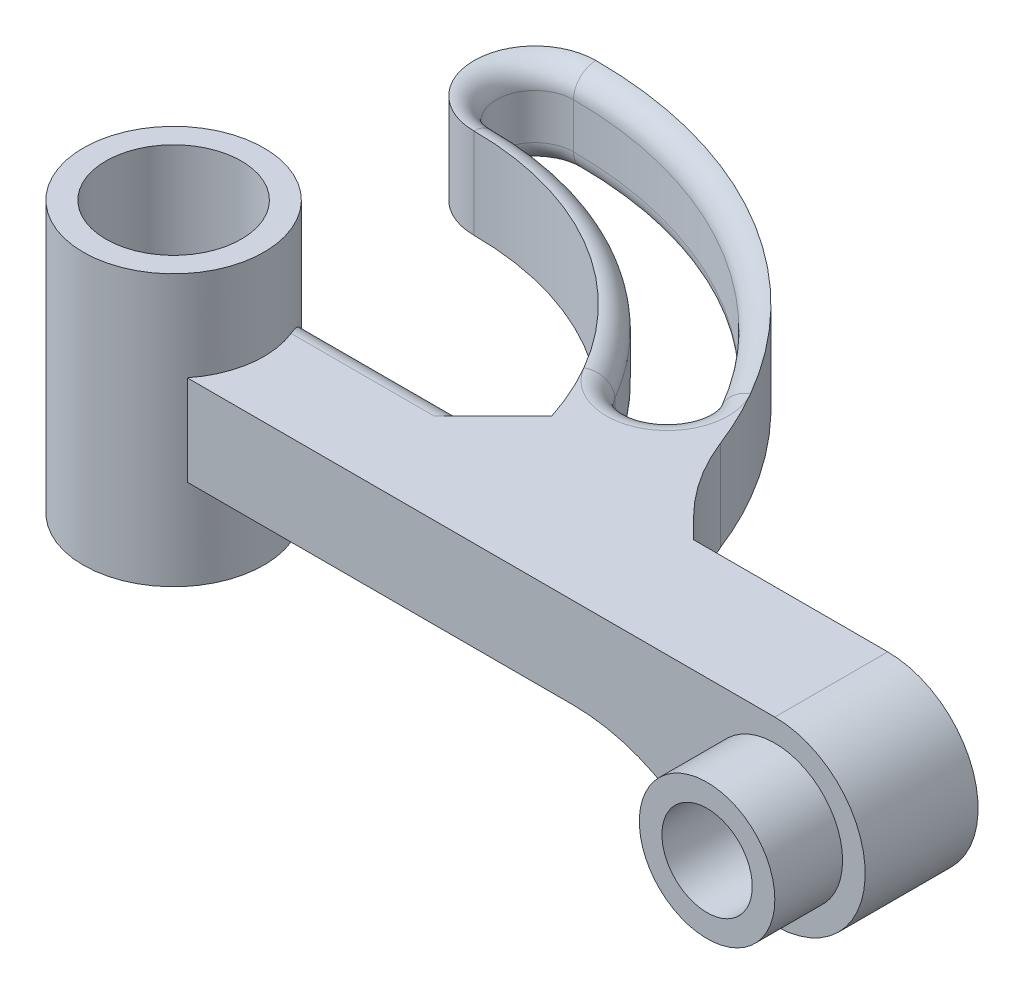
ISO-10303-21;
HEADER;
FILE_DESCRIPTION(('STEP AP214'),'2;1');
FILE_NAME('part.step','',(''),(''),'','','');
FILE_SCHEMA(('AUTOMOTIVE_DESIGN { 1 0 10303 214 1 1 1 1 }'));
ENDSEC;
DATA;
#1=APPLICATION_CONTEXT('core data for automotive mechanical design processes');
#2=APPLICATION_PROTOCOL_DEFINITION('international standard','automotive_design',2000,#1);
#3=PRODUCT_CONTEXT('',#1,'mechanical');
#4=PRODUCT('Part','Part','',(#3));
#5=PRODUCT_RELATED_PRODUCT_CATEGORY('part','',(#4));
#6=PRODUCT_DEFINITION_FORMATION('','',#4);
#7=PRODUCT_DEFINITION_CONTEXT('part definition',#1,'design');
#8=PRODUCT_DEFINITION('design','',#6,#7);
#9=PRODUCT_DEFINITION_SHAPE('','',#8);
#10=(LENGTH_UNIT() NAMED_UNIT(*) SI_UNIT(.MILLI.,.METRE.));
#11=(NAMED_UNIT(*) PLANE_ANGLE_UNIT() SI_UNIT($,.RADIAN.));
#12=(NAMED_UNIT(*) SI_UNIT($,.STERADIAN.) SOLID_ANGLE_UNIT());
#13=UNCERTAINTY_MEASURE_WITH_UNIT(LENGTH_MEASURE(1.E-05),#10,'distance_accuracy_value','');
#14=(GEOMETRIC_REPRESENTATION_CONTEXT(3) GLOBAL_UNCERTAINTY_ASSIGNED_CONTEXT((#13)) GLOBAL_UNIT_ASSIGNED_CONTEXT((#10,
#11,#12)) REPRESENTATION_CONTEXT('',''));
#15=CARTESIAN_POINT('',(0.,0.,0.));
#16=DIRECTION('',(0.,0.,1.));
#17=DIRECTION('',(1.,0.,0.));
#18=AXIS2_PLACEMENT_3D('',#15,#16,#17);
#19=CARTESIAN_POINT('',(0.,0.,0.));
#20=DIRECTION('',(0.,0.,1.));
#21=DIRECTION('',(1.,0.,0.));
#22=AXIS2_PLACEMENT_3D('',#19,#20,#21);
#23=PLANE('',#22);
#24=DIRECTION('',(0.,-1.,0.));
#25=VECTOR('',#24,1.);
#26=CARTESIAN_POINT('',(7.93033812995007,0.,0.));
#27=LINE('',#26,#25);
#28=CARTESIAN_POINT('',(7.93033812995007,3.,0.));
#29=VERTEX_POINT('',#28);
#30=CARTESIAN_POINT('',(7.93033812995007,1.,0.));
#31=VERTEX_POINT('',#30);
#32=EDGE_CURVE('E367',#29,#31,#27,.T.);
#33=ORIENTED_EDGE('',*,*,#32,.T.);
#34=DIRECTION('',(1.,0.,0.));
#35=VECTOR('',#34,1.);
#36=CARTESIAN_POINT('',(0.,1.,0.));
#37=LINE('',#36,#35);
#38=CARTESIAN_POINT('',(0.,1.,0.));
#39=VERTEX_POINT('',#38);
#40=EDGE_CURVE('E72',#31,#39,#37,.F.);
#41=ORIENTED_EDGE('',*,*,#40,.T.);
#42=DIRECTION('',(0.,-1.,0.));
#43=VECTOR('',#42,1.);
#44=CARTESIAN_POINT('',(0.,0.,0.));
#45=LINE('',#44,#43);
#46=CARTESIAN_POINT('',(0.,3.,0.));
#47=VERTEX_POINT('',#46);
#48=EDGE_CURVE('E326',#47,#39,#45,.T.);
#49=ORIENTED_EDGE('',*,*,#48,.F.);
#50=DIRECTION('',(-1.,0.,0.));
#51=VECTOR('',#50,1.);
#52=CARTESIAN_POINT('',(0.,3.,0.));
#53=LINE('',#52,#51);
#54=EDGE_CURVE('E416',#47,#29,#53,.F.);
#55=ORIENTED_EDGE('',*,*,#54,.T.);
#56=EDGE_LOOP('',(#33,#41,#49,#55));
#57=FACE_BOUND('',#56,.T.);
#58=ADVANCED_FACE('F54',(#57),#23,.F.);
#59=CARTESIAN_POINT('',(26.,0.,0.));
#60=DIRECTION('',(0.,0.,1.));
#61=DIRECTION('',(1.,0.,0.));
#62=AXIS2_PLACEMENT_3D('',#59,#60,#61);
#63=CIRCLE('',#62,2.);
#64=CARTESIAN_POINT('',(28.,0.,0.));
#65=VERTEX_POINT('',#64);
#66=EDGE_CURVE('E312',#65,#65,#63,.T.);
#67=ORIENTED_EDGE('',*,*,#66,.T.);
#68=EDGE_LOOP('',(#67));
#69=FACE_BOUND('',#68,.T.);
#70=CARTESIAN_POINT('',(17.0557280900008,-8.,0.));
#71=DIRECTION('',(0.,0.,1.));
#72=DIRECTION('',(1.,0.,0.));
#73=AXIS2_PLACEMENT_3D('',#70,#71,#72);
#74=CIRCLE('',#73,8.);
#75=CARTESIAN_POINT('',(23.0185760300003,-2.66666666666666,0.));
#76=VERTEX_POINT('',#75);
#77=CARTESIAN_POINT('',(17.4018408581931,-0.00749063486977716,0.));
#78=VERTEX_POINT('',#77);
#79=EDGE_CURVE('E319',#76,#78,#74,.T.);
#80=ORIENTED_EDGE('',*,*,#79,.T.);
#81=DIRECTION('',(0.,1.,0.));
#82=VECTOR('',#81,1.);
#83=CARTESIAN_POINT('',(17.4018408581931,4.,0.));
#84=LINE('',#83,#82);
#85=CARTESIAN_POINT('',(17.4018408581931,4.,0.));
#86=VERTEX_POINT('',#85);
#87=EDGE_CURVE('E363',#78,#86,#84,.T.);
#88=ORIENTED_EDGE('',*,*,#87,.T.);
#89=DIRECTION('',(-1.,0.,0.));
#90=VECTOR('',#89,1.);
#91=CARTESIAN_POINT('',(0.,4.,0.));
#92=LINE('',#91,#90);
#93=CARTESIAN_POINT('',(26.,4.,0.));
#94=VERTEX_POINT('',#93);
#95=EDGE_CURVE('E346',#94,#86,#92,.T.);
#96=ORIENTED_EDGE('',*,*,#95,.F.);
#97=CARTESIAN_POINT('',(26.,0.,0.));
#98=DIRECTION('',(0.,0.,1.));
#99=DIRECTION('',(1.,0.,0.));
#100=AXIS2_PLACEMENT_3D('',#97,#98,#99);
#101=CIRCLE('',#100,4.);
#102=EDGE_CURVE('E343',#76,#94,#101,.T.);
#103=ORIENTED_EDGE('',*,*,#102,.F.);
#104=EDGE_LOOP('',(#80,#88,#96,#103));
#105=FACE_BOUND('',#104,.T.);
#106=ADVANCED_FACE('F462',(#69,#105),#23,.F.);
#107=CARTESIAN_POINT('',(17.0557280900008,-8.,5.));
#108=DIRECTION('',(0.,0.,-1.));
#109=DIRECTION('',(-1.,0.,0.));
#110=AXIS2_PLACEMENT_3D('',#107,#108,#109);
#111=CYLINDRICAL_SURFACE('',#110,8.);
#112=ORIENTED_EDGE('',*,*,#79,.F.);
#113=DIRECTION('',(0.,0.,-1.));
#114=VECTOR('',#113,1.);
#115=CARTESIAN_POINT('',(23.0185760300003,-2.66666666666666,5.));
#116=LINE('',#115,#114);
#117=CARTESIAN_POINT('',(23.0185760300003,-2.66666666666666,5.));
#118=VERTEX_POINT('',#117);
#119=EDGE_CURVE('E361',#118,#76,#116,.T.);
#120=ORIENTED_EDGE('',*,*,#119,.F.);
#121=CARTESIAN_POINT('',(17.0557280900008,-8.,5.));
#122=DIRECTION('',(0.,0.,1.));
#123=DIRECTION('',(1.,0.,0.));
#124=AXIS2_PLACEMENT_3D('',#121,#122,#123);
#125=CIRCLE('',#124,8.);
#126=CARTESIAN_POINT('',(17.0557280900008,0.,5.));
#127=VERTEX_POINT('',#126);
#128=EDGE_CURVE('E325',#118,#127,#125,.T.);
#129=ORIENTED_EDGE('',*,*,#128,.T.);
#130=DIRECTION('',(0.,0.,-1.));
#131=VECTOR('',#130,1.);
#132=CARTESIAN_POINT('',(17.0557280900008,0.,5.));
#133=LINE('',#132,#131);
#134=CARTESIAN_POINT('',(17.0557280900008,0.,-0.346112768192244));
#135=VERTEX_POINT('',#134);
#136=EDGE_CURVE('E340',#127,#135,#133,.T.);
#137=ORIENTED_EDGE('',*,*,#136,.T.);
#138=CARTESIAN_POINT('',(17.0557280900008,-8.,-0.346112768192243));
#139=DIRECTION('',(-0.70710678118655,0.,0.707106781186544));
#140=DIRECTION('',(-0.707106781186545,0.,-0.70710678118655));
#141=AXIS2_PLACEMENT_3D('',#138,#139,#140);
#142=ELLIPSE('',#141,11.3137084989848,8.);
#143=EDGE_CURVE('E371',#135,#78,#142,.F.);
#144=ORIENTED_EDGE('',*,*,#143,.T.);
#145=EDGE_LOOP('',(#112,#120,#129,#137,#144));
#146=FACE_BOUND('',#145,.T.);
#147=ADVANCED_FACE('F477',(#146),#111,.F.);
#148=CARTESIAN_POINT('',(26.,0.,5.));
#149=DIRECTION('',(0.,0.,-1.));
#150=DIRECTION('',(-1.,0.,0.));
#151=AXIS2_PLACEMENT_3D('',#148,#149,#150);
#152=CYLINDRICAL_SURFACE('',#151,4.);
#153=ORIENTED_EDGE('',*,*,#102,.T.);
#154=DIRECTION('',(0.,0.,-1.));
#155=VECTOR('',#154,1.);
#156=CARTESIAN_POINT('',(26.,4.,5.));
#157=LINE('',#156,#155);
#158=CARTESIAN_POINT('',(26.,4.,5.));
#159=VERTEX_POINT('',#158);
#160=EDGE_CURVE('E358',#159,#94,#157,.T.);
#161=ORIENTED_EDGE('',*,*,#160,.F.);
#162=CARTESIAN_POINT('',(26.,0.,5.));
#163=DIRECTION('',(0.,0.,1.));
#164=DIRECTION('',(1.,0.,0.));
#165=AXIS2_PLACEMENT_3D('',#162,#163,#164);
#166=CIRCLE('',#165,4.);
#167=EDGE_CURVE('E329',#118,#159,#166,.T.);
#168=ORIENTED_EDGE('',*,*,#167,.F.);
#169=ORIENTED_EDGE('',*,*,#119,.T.);
#170=EDGE_LOOP('',(#153,#161,#168,#169));
#171=FACE_BOUND('',#170,.T.);
#172=ADVANCED_FACE('F473',(#171),#152,.T.);
#173=CARTESIAN_POINT('',(0.,4.,5.));
#174=DIRECTION('',(0.,-1.,0.));
#175=DIRECTION('',(1.,0.,0.));
#176=AXIS2_PLACEMENT_3D('',#173,#174,#175);
#177=PLANE('',#176);
#178=CARTESIAN_POINT('',(-3.13372434406058,4.,2.48591466777162));
#179=DIRECTION('',(0.,1.,0.));
#180=DIRECTION('',(0.,0.,1.));
#181=AXIS2_PLACEMENT_3D('',#178,#179,#180);
#182=CIRCLE('',#181,18.7015226412835);
#183=CARTESIAN_POINT('',(14.2916540316551,4.,-4.30401446039909));
#184=VERTEX_POINT('',#183);
#185=CARTESIAN_POINT('',(13.0622693527408,4.,-6.8648466528701));
#186=VERTEX_POINT('',#185);
#187=EDGE_CURVE('E283',#184,#186,#182,.T.);
#188=ORIENTED_EDGE('',*,*,#187,.T.);
#189=CARTESIAN_POINT('',(10.7226821164904,4.,-5.51408533222835));
#190=DIRECTION('',(0.,-1.,0.));
#191=DIRECTION('',(1.,0.,0.));
#192=AXIS2_PLACEMENT_3D('',#189,#190,#191);
#193=CIRCLE('',#192,2.70152264128351);
#194=CARTESIAN_POINT('',(8.3830948802401,4.,-4.1633240115866));
#195=VERTEX_POINT('',#194);
#196=EDGE_CURVE('E411',#186,#195,#193,.T.);
#197=ORIENTED_EDGE('',*,*,#196,.T.);
#198=CARTESIAN_POINT('',(-3.13372434406058,4.,2.48591466777162));
#199=DIRECTION('',(0.,-1.,0.));
#200=DIRECTION('',(0.,0.,1.));
#201=AXIS2_PLACEMENT_3D('',#198,#199,#200);
#202=CIRCLE('',#201,13.2984773587165);
#203=CARTESIAN_POINT('',(9.52365853302295,4.,-1.5933204030729));
#204=VERTEX_POINT('',#203);
#205=EDGE_CURVE('E208',#195,#204,#202,.T.);
#206=ORIENTED_EDGE('',*,*,#205,.T.);
#207=DIRECTION('',(0.707106781186543,0.,-0.707106781186553));
#208=VECTOR('',#207,1.);
#209=CARTESIAN_POINT('',(1.46516906497509,4.,6.46516906497507));
#210=LINE('',#209,#208);
#211=CARTESIAN_POINT('',(6.93033812995009,4.,0.999999999999999));
#212=VERTEX_POINT('',#211);
#213=EDGE_CURVE('E376',#204,#212,#210,.F.);
#214=ORIENTED_EDGE('',*,*,#213,.T.);
#215=DIRECTION('',(-1.,0.,0.));
#216=VECTOR('',#215,1.);
#217=CARTESIAN_POINT('',(0.,4.,1.));
#218=LINE('',#217,#216);
#219=CARTESIAN_POINT('',(0.58004161519172,4.,1.));
#220=VERTEX_POINT('',#219);
#221=EDGE_CURVE('E408',#212,#220,#218,.T.);
#222=ORIENTED_EDGE('',*,*,#221,.T.);
#223=CARTESIAN_POINT('',(-3.13372434406058,4.,2.48591466777162));
#224=DIRECTION('',(0.,-1.,0.));
#225=DIRECTION('',(1.,0.,0.));
#226=AXIS2_PLACEMENT_3D('',#223,#224,#225);
#227=CIRCLE('',#226,4.);
#228=CARTESIAN_POINT('',(0.,4.,4.97182933554324));
#229=VERTEX_POINT('',#228);
#230=EDGE_CURVE('E310',#220,#229,#227,.T.);
#231=ORIENTED_EDGE('',*,*,#230,.T.);
#232=DIRECTION('',(0.,0.,-1.));
#233=VECTOR('',#232,1.);
#234=CARTESIAN_POINT('',(0.,4.,5.));
#235=LINE('',#234,#233);
#236=CARTESIAN_POINT('',(0.,4.,5.));
#237=VERTEX_POINT('',#236);
#238=EDGE_CURVE('E355',#237,#229,#235,.T.);
#239=ORIENTED_EDGE('',*,*,#238,.F.);
#240=DIRECTION('',(-1.,0.,0.));
#241=VECTOR('',#240,1.);
#242=CARTESIAN_POINT('',(0.,4.,5.));
#243=LINE('',#242,#241);
#244=EDGE_CURVE('E332',#159,#237,#243,.T.);
#245=ORIENTED_EDGE('',*,*,#244,.F.);
#246=ORIENTED_EDGE('',*,*,#160,.T.);
#247=ORIENTED_EDGE('',*,*,#95,.T.);
#248=DIRECTION('',(-0.707106781186545,0.,-0.70710678118655));
#249=VECTOR('',#248,1.);
#250=CARTESIAN_POINT('',(11.2009204290966,4.,-6.20092042909652));
#251=LINE('',#250,#249);
#252=CARTESIAN_POINT('',(16.5382116933696,4.,-0.863629164823515));
#253=VERTEX_POINT('',#252);
#254=EDGE_CURVE('E373',#86,#253,#251,.T.);
#255=ORIENTED_EDGE('',*,*,#254,.T.);
#256=CARTESIAN_POINT('',(23.6092795052351,4.,-7.93469697668896));
#257=DIRECTION('',(0.,-1.,0.));
#258=DIRECTION('',(1.,0.,0.));
#259=AXIS2_PLACEMENT_3D('',#256,#257,#258);
#260=CIRCLE('',#259,10.);
#261=EDGE_CURVE('E388',#253,#184,#260,.T.);
#262=ORIENTED_EDGE('',*,*,#261,.T.);
#263=EDGE_LOOP('',(#188,#197,#206,#214,#222,#231,#239,#245,#246,#247,#255,#262));
#264=FACE_BOUND('',#263,.T.);
#265=ADVANCED_FACE('F469',(#264),#177,.F.);
#266=CARTESIAN_POINT('',(0.,0.,5.));
#267=DIRECTION('',(1.,0.,0.));
#268=DIRECTION('',(0.,1.,0.));
#269=AXIS2_PLACEMENT_3D('',#266,#267,#268);
#270=PLANE('',#269);
#271=ORIENTED_EDGE('',*,*,#238,.T.);
#272=DIRECTION('',(0.,1.,0.));
#273=VECTOR('',#272,1.);
#274=CARTESIAN_POINT('',(0.,-4.,4.97182933554324));
#275=LINE('',#274,#273);
#276=CARTESIAN_POINT('',(0.,0.,4.97182933554324));
#277=VERTEX_POINT('',#276);
#278=EDGE_CURVE('E308',#229,#277,#275,.F.);
#279=ORIENTED_EDGE('',*,*,#278,.T.);
#280=DIRECTION('',(0.,0.,-1.));
#281=VECTOR('',#280,1.);
#282=CARTESIAN_POINT('',(0.,0.,5.));
#283=LINE('',#282,#281);
#284=CARTESIAN_POINT('',(0.,0.,5.));
#285=VERTEX_POINT('',#284);
#286=EDGE_CURVE('E352',#285,#277,#283,.T.);
#287=ORIENTED_EDGE('',*,*,#286,.F.);
#288=DIRECTION('',(0.,-1.,0.));
#289=VECTOR('',#288,1.);
#290=CARTESIAN_POINT('',(0.,0.,5.));
#291=LINE('',#290,#289);
#292=EDGE_CURVE('E335',#237,#285,#291,.T.);
#293=ORIENTED_EDGE('',*,*,#292,.F.);
#294=EDGE_LOOP('',(#271,#279,#287,#293));
#295=FACE_BOUND('',#294,.T.);
#296=ADVANCED_FACE('F465',(#295),#270,.F.);
#297=CARTESIAN_POINT('',(0.,0.,5.));
#298=DIRECTION('',(0.,1.,0.));
#299=DIRECTION('',(0.,0.,1.));
#300=AXIS2_PLACEMENT_3D('',#297,#298,#299);
#301=PLANE('',#300);
#302=CARTESIAN_POINT('',(-3.13372434406058,0.,2.48591466777162));
#303=DIRECTION('',(0.,-1.,0.));
#304=DIRECTION('',(0.,0.,1.));
#305=AXIS2_PLACEMENT_3D('',#302,#303,#304);
#306=CIRCLE('',#305,13.2984773587165);
#307=CARTESIAN_POINT('',(8.3830948802401,0.,-4.1633240115866));
#308=VERTEX_POINT('',#307);
#309=CARTESIAN_POINT('',(9.52365853302295,0.,-1.5933204030729));
#310=VERTEX_POINT('',#309);
#311=EDGE_CURVE('E287',#308,#310,#306,.T.);
#312=ORIENTED_EDGE('',*,*,#311,.F.);
#313=CARTESIAN_POINT('',(10.7226821164904,0.,-5.51408533222835));
#314=DIRECTION('',(0.,1.,0.));
#315=DIRECTION('',(0.,0.,1.));
#316=AXIS2_PLACEMENT_3D('',#313,#314,#315);
#317=CIRCLE('',#316,2.70152264128351);
#318=CARTESIAN_POINT('',(13.0622693527408,0.,-6.8648466528701));
#319=VERTEX_POINT('',#318);
#320=EDGE_CURVE('E393',#308,#319,#317,.T.);
#321=ORIENTED_EDGE('',*,*,#320,.T.);
#322=CARTESIAN_POINT('',(-3.13372434406058,0.,2.48591466777162));
#323=DIRECTION('',(0.,1.,0.));
#324=DIRECTION('',(0.,0.,1.));
#325=AXIS2_PLACEMENT_3D('',#322,#323,#324);
#326=CIRCLE('',#325,18.7015226412835);
#327=CARTESIAN_POINT('',(14.2916540316551,0.,-4.30401446039909));
#328=VERTEX_POINT('',#327);
#329=EDGE_CURVE('E234',#328,#319,#326,.T.);
#330=ORIENTED_EDGE('',*,*,#329,.F.);
#331=CARTESIAN_POINT('',(23.6092795052351,0.,-7.93469697668896));
#332=DIRECTION('',(0.,1.,0.));
#333=DIRECTION('',(0.,0.,1.));
#334=AXIS2_PLACEMENT_3D('',#331,#332,#333);
#335=CIRCLE('',#334,10.);
#336=CARTESIAN_POINT('',(16.5382116933696,0.,-0.863629164823515));
#337=VERTEX_POINT('',#336);
#338=EDGE_CURVE('E386',#328,#337,#335,.T.);
#339=ORIENTED_EDGE('',*,*,#338,.T.);
#340=DIRECTION('',(0.707106781186545,0.,0.70710678118655));
#341=VECTOR('',#340,1.);
#342=CARTESIAN_POINT('',(11.2009204290966,0.,-6.20092042909652));
#343=LINE('',#342,#341);
#344=EDGE_CURVE('E369',#337,#135,#343,.T.);
#345=ORIENTED_EDGE('',*,*,#344,.T.);
#346=ORIENTED_EDGE('',*,*,#136,.F.);
#347=DIRECTION('',(1.,0.,0.));
#348=VECTOR('',#347,1.);
#349=CARTESIAN_POINT('',(0.,0.,5.));
#350=LINE('',#349,#348);
#351=EDGE_CURVE('E338',#285,#127,#350,.T.);
#352=ORIENTED_EDGE('',*,*,#351,.F.);
#353=ORIENTED_EDGE('',*,*,#286,.T.);
#354=CARTESIAN_POINT('',(-3.13372434406058,0.,2.48591466777162));
#355=DIRECTION('',(0.,1.,0.));
#356=DIRECTION('',(0.,0.,1.));
#357=AXIS2_PLACEMENT_3D('',#354,#355,#356);
#358=CIRCLE('',#357,4.);
#359=CARTESIAN_POINT('',(0.58004161519172,0.,1.));
#360=VERTEX_POINT('',#359);
#361=EDGE_CURVE('E305',#277,#360,#358,.T.);
#362=ORIENTED_EDGE('',*,*,#361,.T.);
#363=DIRECTION('',(1.,0.,0.));
#364=VECTOR('',#363,1.);
#365=CARTESIAN_POINT('',(0.,0.,1.));
#366=LINE('',#365,#364);
#367=CARTESIAN_POINT('',(6.93033812995009,0.,0.999999999999999));
#368=VERTEX_POINT('',#367);
#369=EDGE_CURVE('E390',#360,#368,#366,.T.);
#370=ORIENTED_EDGE('',*,*,#369,.T.);
#371=DIRECTION('',(-0.707106781186543,0.,0.707106781186553));
#372=VECTOR('',#371,1.);
#373=CARTESIAN_POINT('',(1.46516906497509,0.,6.46516906497507));
#374=LINE('',#373,#372);
#375=EDGE_CURVE('E378',#368,#310,#374,.F.);
#376=ORIENTED_EDGE('',*,*,#375,.T.);
#377=EDGE_LOOP('',(#312,#321,#330,#339,#345,#346,#352,#353,#362,#370,#376));
#378=FACE_BOUND('',#377,.T.);
#379=ADVANCED_FACE('F458',(#378),#301,.F.);
#380=CARTESIAN_POINT('',(0.,0.,5.));
#381=DIRECTION('',(0.,0.,1.));
#382=DIRECTION('',(1.,0.,0.));
#383=AXIS2_PLACEMENT_3D('',#380,#381,#382);
#384=PLANE('',#383);
#385=CARTESIAN_POINT('',(26.,0.,5.));
#386=DIRECTION('',(0.,0.,1.));
#387=DIRECTION('',(1.,0.,0.));
#388=AXIS2_PLACEMENT_3D('',#385,#386,#387);
#389=CIRCLE('',#388,3.);
#390=CARTESIAN_POINT('',(29.,0.,5.));
#391=VERTEX_POINT('',#390);
#392=EDGE_CURVE('E322',#391,#391,#389,.T.);
#393=ORIENTED_EDGE('',*,*,#392,.F.);
#394=EDGE_LOOP('',(#393));
#395=FACE_BOUND('',#394,.T.);
#396=ORIENTED_EDGE('',*,*,#128,.F.);
#397=ORIENTED_EDGE('',*,*,#167,.T.);
#398=ORIENTED_EDGE('',*,*,#244,.T.);
#399=ORIENTED_EDGE('',*,*,#292,.T.);
#400=ORIENTED_EDGE('',*,*,#351,.T.);
#401=EDGE_LOOP('',(#396,#397,#398,#399,#400));
#402=FACE_BOUND('',#401,.T.);
#403=ADVANCED_FACE('F454',(#395,#402),#384,.T.);
#404=CARTESIAN_POINT('',(26.,0.,8.));
#405=DIRECTION('',(0.,0.,-1.));
#406=DIRECTION('',(-1.,0.,0.));
#407=AXIS2_PLACEMENT_3D('',#404,#405,#406);
#408=CYLINDRICAL_SURFACE('',#407,2.);
#409=CARTESIAN_POINT('',(26.,0.,8.));
#410=DIRECTION('',(0.,0.,1.));
#411=DIRECTION('',(1.,0.,0.));
#412=AXIS2_PLACEMENT_3D('',#409,#410,#411);
#413=CIRCLE('',#412,2.);
#414=CARTESIAN_POINT('',(28.,0.,8.));
#415=VERTEX_POINT('',#414);
#416=EDGE_CURVE('E313',#415,#415,#413,.T.);
#417=ORIENTED_EDGE('',*,*,#416,.T.);
#418=EDGE_LOOP('',(#417));
#419=FACE_BOUND('',#418,.T.);
#420=ORIENTED_EDGE('',*,*,#66,.F.);
#421=EDGE_LOOP('',(#420));
#422=FACE_BOUND('',#421,.T.);
#423=ADVANCED_FACE('F450',(#419,#422),#408,.F.);
#424=CARTESIAN_POINT('',(26.,0.,8.));
#425=DIRECTION('',(0.,0.,-1.));
#426=DIRECTION('',(-1.,0.,0.));
#427=AXIS2_PLACEMENT_3D('',#424,#425,#426);
#428=CYLINDRICAL_SURFACE('',#427,3.);
#429=ORIENTED_EDGE('',*,*,#392,.T.);
#430=EDGE_LOOP('',(#429));
#431=FACE_BOUND('',#430,.T.);
#432=CARTESIAN_POINT('',(26.,0.,8.));
#433=DIRECTION('',(0.,0.,1.));
#434=DIRECTION('',(1.,0.,0.));
#435=AXIS2_PLACEMENT_3D('',#432,#433,#434);
#436=CIRCLE('',#435,3.);
#437=CARTESIAN_POINT('',(29.,0.,8.));
#438=VERTEX_POINT('',#437);
#439=EDGE_CURVE('E316',#438,#438,#436,.T.);
#440=ORIENTED_EDGE('',*,*,#439,.F.);
#441=EDGE_LOOP('',(#440));
#442=FACE_BOUND('',#441,.T.);
#443=ADVANCED_FACE('F446',(#431,#442),#428,.T.);
#444=CARTESIAN_POINT('',(0.,0.,8.));
#445=DIRECTION('',(0.,0.,1.));
#446=DIRECTION('',(1.,0.,0.));
#447=AXIS2_PLACEMENT_3D('',#444,#445,#446);
#448=PLANE('',#447);
#449=ORIENTED_EDGE('',*,*,#416,.F.);
#450=EDGE_LOOP('',(#449));
#451=FACE_BOUND('',#450,.T.);
#452=ORIENTED_EDGE('',*,*,#439,.T.);
#453=EDGE_LOOP('',(#452));
#454=FACE_BOUND('',#453,.T.);
#455=ADVANCED_FACE('F440',(#451,#454),#448,.T.);
#456=CARTESIAN_POINT('',(-3.13372434406058,-4.,2.48591466777162));
#457=DIRECTION('',(0.,1.,0.));
#458=DIRECTION('',(0.,0.,1.));
#459=AXIS2_PLACEMENT_3D('',#456,#457,#458);
#460=CYLINDRICAL_SURFACE('',#459,4.);
#461=CARTESIAN_POINT('',(-3.13372434406058,8.,2.48591466777162));
#462=DIRECTION('',(0.,1.,0.));
#463=DIRECTION('',(0.,0.,1.));
#464=AXIS2_PLACEMENT_3D('',#461,#462,#463);
#465=CIRCLE('',#464,4.);
#466=CARTESIAN_POINT('',(-3.13372434406058,8.,6.48591466777162));
#467=VERTEX_POINT('',#466);
#468=EDGE_CURVE('E296',#467,#467,#465,.T.);
#469=ORIENTED_EDGE('',*,*,#468,.F.);
#470=EDGE_LOOP('',(#469));
#471=FACE_BOUND('',#470,.T.);
#472=CARTESIAN_POINT('',(-3.13372434406058,-4.,2.48591466777162));
#473=DIRECTION('',(0.,1.,0.));
#474=DIRECTION('',(0.,0.,1.));
#475=AXIS2_PLACEMENT_3D('',#472,#473,#474);
#476=CIRCLE('',#475,4.);
#477=CARTESIAN_POINT('',(-3.13372434406058,-4.,6.48591466777162));
#478=VERTEX_POINT('',#477);
#479=EDGE_CURVE('E302',#478,#478,#476,.T.);
#480=ORIENTED_EDGE('',*,*,#479,.T.);
#481=EDGE_LOOP('',(#480));
#482=FACE_BOUND('',#481,.T.);
#483=ORIENTED_EDGE('',*,*,#230,.F.);
#484=CARTESIAN_POINT('',(0.58004161519172,4.,1.));
#485=CARTESIAN_POINT('',(0.567616664473097,3.99999902373956,0.968939650530784));
#486=CARTESIAN_POINT('',(0.554805573594236,3.998552621073,0.938058138411988));
#487=CARTESIAN_POINT('',(0.528520924821578,3.99286490791682,0.87685748899939));
#488=CARTESIAN_POINT('',(0.515047721661676,3.9886250792494,0.846538062299813));
#489=CARTESIAN_POINT('',(0.473880734634785,3.97189816355897,0.756901818292173));
#490=CARTESIAN_POINT('',(0.445346238813433,3.9554021606082,0.698674796842789));
#491=CARTESIAN_POINT('',(0.387228473663419,3.91258203690492,0.586737893564835));
#492=CARTESIAN_POINT('',(0.357647238304291,3.88627612103666,0.533019868922615));
#493=CARTESIAN_POINT('',(0.298559985701094,3.82446299055438,0.430943598850166));
#494=CARTESIAN_POINT('',(0.269054196367417,3.7889394659986,0.382595073156039));
#495=CARTESIAN_POINT('',(0.210286216545723,3.70732220567701,0.290299122836316));
#496=CARTESIAN_POINT('',(0.181104017186486,3.66080220913391,0.246675277634623));
#497=CARTESIAN_POINT('',(0.126752906060125,3.5588471731201,0.168252023570959));
#498=CARTESIAN_POINT('',(0.101575651011058,3.50343116360428,0.133434177889201));
#499=CARTESIAN_POINT('',(0.0645504467940003,3.40265656662438,0.0834786020729643));
#500=CARTESIAN_POINT('',(0.0509719396350633,3.35929752594549,0.0655720252555286));
#501=CARTESIAN_POINT('',(0.0281633845113325,3.26951100986622,0.0358495899250828));
#502=CARTESIAN_POINT('',(0.018922155204384,3.22309178020376,0.0240180626644928));
#503=CARTESIAN_POINT('',(0.00824688042586677,3.1469493553646,0.0104228023431005));
#504=CARTESIAN_POINT('',(0.00517237581203748,3.1178173488416,0.00653045068166495));
#505=CARTESIAN_POINT('',(0.00104139832589071,3.05913159065424,0.00131265579951263));
#506=CARTESIAN_POINT('',(-1.14614508307064E-05,3.02957717882166,-8.191672204928E-06));
#507=CARTESIAN_POINT('',(0.,3.,0.));
#508=B_SPLINE_CURVE_WITH_KNOTS('',3,(#484,#485,#486,#487,#488,#489,#490,#491,#492,#493,#494,
#495,#496,#497,#498,#499,#500,#501,#502,#503,#504,#505,#506,#507),.UNSPECIFIED.,.F.,.F.,(4,2,2,
2,2,2,2,2,2,2,2,4),(0.,0.100285319280589,0.200517483226687,0.400240884541104,0.59959547598273,
0.799305246440186,1.00862164876863,1.21749611545462,1.36344485964585,1.50901525820503,
1.59749938212507,1.6861414987382),.UNSPECIFIED.);
#509=EDGE_CURVE('E64',#220,#47,#508,.T.);
#510=ORIENTED_EDGE('',*,*,#509,.T.);
#511=ORIENTED_EDGE('',*,*,#48,.T.);
#512=CARTESIAN_POINT('',(0.,1.,0.));
#513=CARTESIAN_POINT('',(-4.22110242938505E-06,0.975619467297265,-2.7035387830354E-06));
#514=CARTESIAN_POINT('',(0.00070800155636521,0.951253592493144,0.000892289654360036));
#515=CARTESIAN_POINT('',(0.00352116198511422,0.902749230359358,0.00444362192923776));
#516=CARTESIAN_POINT('',(0.00562105372998958,0.878610585633741,0.00709863431308264));
#517=CARTESIAN_POINT('',(0.0138917768768872,0.80717386225815,0.017596435842353));
#518=CARTESIAN_POINT('',(0.0220352149331976,0.760445272919626,0.0279732862477167));
#519=CARTESIAN_POINT('',(0.0427683998995397,0.670033226627332,0.054829479091648));
#520=CARTESIAN_POINT('',(0.0553462012481472,0.626341962416957,0.0712924321442906));
#521=CARTESIAN_POINT('',(0.0839771324714537,0.542530307544076,0.10957956087658));
#522=CARTESIAN_POINT('',(0.100036735421274,0.502416767018705,0.131413732598833));
#523=CARTESIAN_POINT('',(0.136406855831754,0.422422785722524,0.182154797634922));
#524=CARTESIAN_POINT('',(0.156983247088912,0.38297805080305,0.211554247843593));
#525=CARTESIAN_POINT('',(0.200044237322564,0.309372672556004,0.275153522591401));
#526=CARTESIAN_POINT('',(0.222529671940715,0.275214361904208,0.309355453638496));
#527=CARTESIAN_POINT('',(0.273107273932384,0.206111077487696,0.389214632650444));
#528=CARTESIAN_POINT('',(0.301418715310459,0.172385165374923,0.435793110574214));
#529=CARTESIAN_POINT('',(0.358130633102601,0.113389149558237,0.533949493994429));
#530=CARTESIAN_POINT('',(0.386531112198408,0.0881193030621181,0.585527551501347));
#531=CARTESIAN_POINT('',(0.443865179440926,0.0455038436020207,0.69569129404259));
#532=CARTESIAN_POINT('',(0.472743880427026,0.0286634276241812,0.754505468935457));
#533=CARTESIAN_POINT('',(0.514380687844547,0.0115981031104628,0.84504758983099));
#534=CARTESIAN_POINT('',(0.527996289690086,0.00727527613122147,0.875657091605804));
#535=CARTESIAN_POINT('',(0.554553149860152,0.00147612994286926,0.937449792324852));
#536=CARTESIAN_POINT('',(0.567494075158238,1.20377890070157E-06,0.968633264500821));
#537=CARTESIAN_POINT('',(0.58004161519172,0.,1.));
#538=B_SPLINE_CURVE_WITH_KNOTS('',3,(#512,#513,#514,#515,#516,#517,#518,#519,#520,#521,#522,
#523,#524,#525,#526,#527,#528,#529,#530,#531,#532,#533,#534,#535,#536,#537),.UNSPECIFIED.,.F.,
.F.,(4,2,2,2,2,2,2,2,2,2,2,2,4),(0.,0.0730870902530261,0.146119150199201,0.290972689639458,
0.435438958346287,0.58017614568014,0.739583174123123,0.899060342826651,1.09055730380118,
1.28206008900139,1.483968712606,1.58519086527515,1.68646251803278),.UNSPECIFIED.);
#539=EDGE_CURVE('E421',#39,#360,#538,.T.);
#540=ORIENTED_EDGE('',*,*,#539,.T.);
#541=ORIENTED_EDGE('',*,*,#361,.F.);
#542=ORIENTED_EDGE('',*,*,#278,.F.);
#543=EDGE_LOOP('',(#483,#510,#511,#540,#541,#542));
#544=FACE_BOUND('',#543,.T.);
#545=ADVANCED_FACE('F434',(#471,#482,#544),#460,.T.);
#546=CARTESIAN_POINT('',(-3.13372434406058,-4.,2.48591466777162));
#547=DIRECTION('',(0.,1.,0.));
#548=DIRECTION('',(0.,0.,1.));
#549=AXIS2_PLACEMENT_3D('',#546,#547,#548);
#550=PLANE('',#549);
#551=CARTESIAN_POINT('',(-3.13372434406058,-4.,2.48591466777162));
#552=DIRECTION('',(0.,1.,0.));
#553=DIRECTION('',(0.,0.,1.));
#554=AXIS2_PLACEMENT_3D('',#551,#552,#553);
#555=CIRCLE('',#554,3.);
#556=CARTESIAN_POINT('',(-3.13372434406058,-4.,5.48591466777162));
#557=VERTEX_POINT('',#556);
#558=EDGE_CURVE('E299',#557,#557,#555,.T.);
#559=ORIENTED_EDGE('',*,*,#558,.T.);
#560=EDGE_LOOP('',(#559));
#561=FACE_BOUND('',#560,.T.);
#562=ORIENTED_EDGE('',*,*,#479,.F.);
#563=EDGE_LOOP('',(#562));
#564=FACE_BOUND('',#563,.T.);
#565=ADVANCED_FACE('F439',(#561,#564),#550,.F.);
#566=CARTESIAN_POINT('',(-3.13372434406058,-4.,2.48591466777162));
#567=DIRECTION('',(0.,1.,0.));
#568=DIRECTION('',(0.,0.,1.));
#569=AXIS2_PLACEMENT_3D('',#566,#567,#568);
#570=CYLINDRICAL_SURFACE('',#569,3.);
#571=ORIENTED_EDGE('',*,*,#558,.F.);
#572=EDGE_LOOP('',(#571));
#573=FACE_BOUND('',#572,.T.);
#574=CARTESIAN_POINT('',(-3.13372434406058,8.,2.48591466777162));
#575=DIRECTION('',(0.,1.,0.));
#576=DIRECTION('',(0.,0.,1.));
#577=AXIS2_PLACEMENT_3D('',#574,#575,#576);
#578=CIRCLE('',#577,3.);
#579=CARTESIAN_POINT('',(-3.13372434406058,8.,5.48591466777162));
#580=VERTEX_POINT('',#579);
#581=EDGE_CURVE('E223',#580,#580,#578,.T.);
#582=ORIENTED_EDGE('',*,*,#581,.T.);
#583=EDGE_LOOP('',(#582));
#584=FACE_BOUND('',#583,.T.);
#585=ADVANCED_FACE('F750',(#573,#584),#570,.F.);
#586=CARTESIAN_POINT('',(-3.13372434406058,8.,2.48591466777162));
#587=DIRECTION('',(0.,1.,0.));
#588=DIRECTION('',(0.,0.,1.));
#589=AXIS2_PLACEMENT_3D('',#586,#587,#588);
#590=PLANE('',#589);
#591=ORIENTED_EDGE('',*,*,#468,.T.);
#592=EDGE_LOOP('',(#591));
#593=FACE_BOUND('',#592,.T.);
#594=ORIENTED_EDGE('',*,*,#581,.F.);
#595=EDGE_LOOP('',(#594));
#596=FACE_BOUND('',#595,.T.);
#597=ADVANCED_FACE('F685',(#593,#596),#590,.T.);
#598=CARTESIAN_POINT('',(-3.13372434406058,4.,2.48591466777162));
#599=DIRECTION('',(0.,-1.,0.));
#600=DIRECTION('',(0.,0.,-1.));
#601=AXIS2_PLACEMENT_3D('',#598,#599,#600);
#602=CYLINDRICAL_SURFACE('',#601,13.2984773587165);
#603=CARTESIAN_POINT('',(-3.13372434406058,0.,-10.8125626909449));
#604=VERTEX_POINT('',#603);
#605=EDGE_CURVE('E288',#604,#308,#306,.T.);
#606=ORIENTED_EDGE('',*,*,#605,.T.);
#607=ORIENTED_EDGE('',*,*,#311,.T.);
#608=DIRECTION('',(0.,-1.,0.));
#609=VECTOR('',#608,1.);
#610=CARTESIAN_POINT('',(9.52365853302295,4.,-1.5933204030729));
#611=LINE('',#610,#609);
#612=EDGE_CURVE('E365',#310,#204,#611,.F.);
#613=ORIENTED_EDGE('',*,*,#612,.T.);
#614=ORIENTED_EDGE('',*,*,#205,.F.);
#615=CARTESIAN_POINT('',(-3.13372434406058,4.,-10.8125626909449));
#616=VERTEX_POINT('',#615);
#617=EDGE_CURVE('E201',#616,#195,#202,.T.);
#618=ORIENTED_EDGE('',*,*,#617,.F.);
#619=DIRECTION('',(0.,-1.,0.));
#620=VECTOR('',#619,1.);
#621=CARTESIAN_POINT('',(-3.13372434406058,4.,-10.8125626909449));
#622=LINE('',#621,#620);
#623=EDGE_CURVE('E205',#616,#604,#622,.T.);
#624=ORIENTED_EDGE('',*,*,#623,.T.);
#625=EDGE_LOOP('',(#606,#607,#613,#614,#618,#624));
#626=FACE_BOUND('',#625,.T.);
#627=ADVANCED_FACE('F204',(#626),#602,.F.);
#628=CARTESIAN_POINT('',(-3.13372434406058,4.,2.48591466777162));
#629=DIRECTION('',(0.,-1.,0.));
#630=DIRECTION('',(0.,0.,-1.));
#631=AXIS2_PLACEMENT_3D('',#628,#629,#630);
#632=CYLINDRICAL_SURFACE('',#631,18.7015226412835);
#633=ORIENTED_EDGE('',*,*,#187,.F.);
#634=DIRECTION('',(0.,-1.,0.));
#635=VECTOR('',#634,1.);
#636=CARTESIAN_POINT('',(14.2916540316551,4.,-4.30401446039909));
#637=LINE('',#636,#635);
#638=EDGE_CURVE('E381',#184,#328,#637,.T.);
#639=ORIENTED_EDGE('',*,*,#638,.T.);
#640=ORIENTED_EDGE('',*,*,#329,.T.);
#641=CARTESIAN_POINT('',(-3.13372434406058,0.,-16.2156079735119));
#642=VERTEX_POINT('',#641);
#643=EDGE_CURVE('E290',#319,#642,#326,.T.);
#644=ORIENTED_EDGE('',*,*,#643,.T.);
#645=DIRECTION('',(0.,-1.,0.));
#646=VECTOR('',#645,1.);
#647=CARTESIAN_POINT('',(-3.13372434406058,4.,-16.2156079735119));
#648=LINE('',#647,#646);
#649=CARTESIAN_POINT('',(-3.13372434406058,4.,-16.2156079735119));
#650=VERTEX_POINT('',#649);
#651=EDGE_CURVE('E224',#650,#642,#648,.T.);
#652=ORIENTED_EDGE('',*,*,#651,.F.);
#653=EDGE_CURVE('E213',#186,#650,#182,.T.);
#654=ORIENTED_EDGE('',*,*,#653,.F.);
#655=EDGE_LOOP('',(#633,#639,#640,#644,#652,#654));
#656=FACE_BOUND('',#655,.T.);
#657=ADVANCED_FACE('F542',(#656),#632,.T.);
#658=CARTESIAN_POINT('',(-3.13372434406058,4.,-13.5140853322284));
#659=DIRECTION('',(0.,-1.,0.));
#660=DIRECTION('',(0.,0.,-1.));
#661=AXIS2_PLACEMENT_3D('',#658,#659,#660);
#662=CYLINDRICAL_SURFACE('',#661,2.70152264128351);
#663=CARTESIAN_POINT('',(-3.13372434406058,0.,-13.5140853322284));
#664=DIRECTION('',(0.,1.,0.));
#665=DIRECTION('',(0.,0.,1.));
#666=AXIS2_PLACEMENT_3D('',#663,#664,#665);
#667=CIRCLE('',#666,2.70152264128351);
#668=EDGE_CURVE('E222',#642,#604,#667,.T.);
#669=ORIENTED_EDGE('',*,*,#668,.T.);
#670=ORIENTED_EDGE('',*,*,#623,.F.);
#671=CARTESIAN_POINT('',(-3.13372434406058,4.,-13.5140853322284));
#672=DIRECTION('',(0.,1.,0.));
#673=DIRECTION('',(0.,0.,1.));
#674=AXIS2_PLACEMENT_3D('',#671,#672,#673);
#675=CIRCLE('',#674,2.70152264128351);
#676=EDGE_CURVE('E220',#650,#616,#675,.T.);
#677=ORIENTED_EDGE('',*,*,#676,.F.);
#678=ORIENTED_EDGE('',*,*,#651,.T.);
#679=EDGE_LOOP('',(#669,#670,#677,#678));
#680=FACE_BOUND('',#679,.T.);
#681=ADVANCED_FACE('F218',(#680),#662,.T.);
#682=CARTESIAN_POINT('',(10.7226821164904,4.,-5.51408533222835));
#683=DIRECTION('',(0.,-1.,0.));
#684=DIRECTION('',(0.,0.,-1.));
#685=AXIS2_PLACEMENT_3D('',#682,#683,#684);
#686=CYLINDRICAL_SURFACE('',#685,1.70152264128351);
#687=DIRECTION('',(0.,-1.,0.));
#688=VECTOR('',#687,1.);
#689=CARTESIAN_POINT('',(12.1962439489564,4.,-6.3648466528701));
#690=LINE('',#689,#688);
#691=CARTESIAN_POINT('',(12.1962439489564,3.,-6.3648466528701));
#692=VERTEX_POINT('',#691);
#693=CARTESIAN_POINT('',(12.1962439489564,1.,-6.3648466528701));
#694=VERTEX_POINT('',#693);
#695=EDGE_CURVE('E280',#692,#694,#690,.T.);
#696=ORIENTED_EDGE('',*,*,#695,.T.);
#697=CARTESIAN_POINT('',(10.7226821164904,1.,-5.51408533222835));
#698=DIRECTION('',(0.,1.,0.));
#699=DIRECTION('',(0.,0.,1.));
#700=AXIS2_PLACEMENT_3D('',#697,#698,#699);
#701=CIRCLE('',#700,1.70152264128351);
#702=CARTESIAN_POINT('',(9.24912028402454,1.,-4.6633240115866));
#703=VERTEX_POINT('',#702);
#704=EDGE_CURVE('E406',#694,#703,#701,.F.);
#705=ORIENTED_EDGE('',*,*,#704,.T.);
#706=DIRECTION('',(0.,-1.,0.));
#707=VECTOR('',#706,1.);
#708=CARTESIAN_POINT('',(9.24912028402454,4.,-4.6633240115866));
#709=LINE('',#708,#707);
#710=CARTESIAN_POINT('',(9.24912028402454,3.,-4.6633240115866));
#711=VERTEX_POINT('',#710);
#712=EDGE_CURVE('E264',#711,#703,#709,.T.);
#713=ORIENTED_EDGE('',*,*,#712,.F.);
#714=CARTESIAN_POINT('',(10.7226821164904,3.,-5.51408533222835));
#715=DIRECTION('',(0.,-1.,0.));
#716=DIRECTION('',(1.,0.,0.));
#717=AXIS2_PLACEMENT_3D('',#714,#715,#716);
#718=CIRCLE('',#717,1.70152264128351);
#719=EDGE_CURVE('E404',#711,#692,#718,.F.);
#720=ORIENTED_EDGE('',*,*,#719,.T.);
#721=EDGE_LOOP('',(#696,#705,#713,#720));
#722=FACE_BOUND('',#721,.T.);
#723=ADVANCED_FACE('F529',(#722),#686,.F.);
#724=CARTESIAN_POINT('',(-3.13372434406058,4.,2.48591466777162));
#725=DIRECTION('',(0.,-1.,0.));
#726=DIRECTION('',(0.,0.,-1.));
#727=AXIS2_PLACEMENT_3D('',#724,#725,#726);
#728=CYLINDRICAL_SURFACE('',#727,17.7015226412835);
#729=DIRECTION('',(0.,-1.,0.));
#730=VECTOR('',#729,1.);
#731=CARTESIAN_POINT('',(-3.13372434406058,4.,-15.2156079735119));
#732=LINE('',#731,#730);
#733=CARTESIAN_POINT('',(-3.13372434406058,3.,-15.2156079735119));
#734=VERTEX_POINT('',#733);
#735=CARTESIAN_POINT('',(-3.13372434406058,1.,-15.2156079735119));
#736=VERTEX_POINT('',#735);
#737=EDGE_CURVE('E275',#734,#736,#732,.T.);
#738=ORIENTED_EDGE('',*,*,#737,.T.);
#739=CARTESIAN_POINT('',(-3.13372434406058,1.,2.48591466777162));
#740=DIRECTION('',(0.,1.,0.));
#741=DIRECTION('',(0.,0.,1.));
#742=AXIS2_PLACEMENT_3D('',#739,#740,#741);
#743=CIRCLE('',#742,17.7015226412835);
#744=EDGE_CURVE('E402',#736,#694,#743,.F.);
#745=ORIENTED_EDGE('',*,*,#744,.T.);
#746=ORIENTED_EDGE('',*,*,#695,.F.);
#747=CARTESIAN_POINT('',(-3.13372434406058,3.,2.48591466777162));
#748=DIRECTION('',(0.,-1.,0.));
#749=DIRECTION('',(1.,0.,0.));
#750=AXIS2_PLACEMENT_3D('',#747,#748,#749);
#751=CIRCLE('',#750,17.7015226412835);
#752=EDGE_CURVE('E400',#692,#734,#751,.F.);
#753=ORIENTED_EDGE('',*,*,#752,.T.);
#754=EDGE_LOOP('',(#738,#745,#746,#753));
#755=FACE_BOUND('',#754,.T.);
#756=ADVANCED_FACE('F532',(#755),#728,.F.);
#757=CARTESIAN_POINT('',(-3.13372434406058,4.,-13.5140853322284));
#758=DIRECTION('',(0.,-1.,0.));
#759=DIRECTION('',(0.,0.,-1.));
#760=AXIS2_PLACEMENT_3D('',#757,#758,#759);
#761=CYLINDRICAL_SURFACE('',#760,1.70152264128351);
#762=DIRECTION('',(0.,-1.,0.));
#763=VECTOR('',#762,1.);
#764=CARTESIAN_POINT('',(-3.13372434406058,4.,-11.8125626909449));
#765=LINE('',#764,#763);
#766=CARTESIAN_POINT('',(-3.13372434406058,3.,-11.8125626909449));
#767=VERTEX_POINT('',#766);
#768=CARTESIAN_POINT('',(-3.13372434406058,1.,-11.8125626909449));
#769=VERTEX_POINT('',#768);
#770=EDGE_CURVE('E270',#767,#769,#765,.T.);
#771=ORIENTED_EDGE('',*,*,#770,.T.);
#772=CARTESIAN_POINT('',(-3.13372434406058,1.,-13.5140853322284));
#773=DIRECTION('',(0.,1.,0.));
#774=DIRECTION('',(0.,0.,1.));
#775=AXIS2_PLACEMENT_3D('',#772,#773,#774);
#776=CIRCLE('',#775,1.70152264128351);
#777=EDGE_CURVE('E397',#769,#736,#776,.F.);
#778=ORIENTED_EDGE('',*,*,#777,.T.);
#779=ORIENTED_EDGE('',*,*,#737,.F.);
#780=CARTESIAN_POINT('',(-3.13372434406058,3.,-13.5140853322284));
#781=DIRECTION('',(0.,-1.,0.));
#782=DIRECTION('',(1.,0.,0.));
#783=AXIS2_PLACEMENT_3D('',#780,#781,#782);
#784=CIRCLE('',#783,1.70152264128351);
#785=EDGE_CURVE('E395',#734,#767,#784,.F.);
#786=ORIENTED_EDGE('',*,*,#785,.T.);
#787=EDGE_LOOP('',(#771,#778,#779,#786));
#788=FACE_BOUND('',#787,.T.);
#789=ADVANCED_FACE('F536',(#788),#761,.F.);
#790=CARTESIAN_POINT('',(-3.13372434406058,4.,2.48591466777162));
#791=DIRECTION('',(0.,-1.,0.));
#792=DIRECTION('',(0.,0.,-1.));
#793=AXIS2_PLACEMENT_3D('',#790,#791,#792);
#794=CYLINDRICAL_SURFACE('',#793,14.2984773587165);
#795=ORIENTED_EDGE('',*,*,#712,.T.);
#796=CARTESIAN_POINT('',(-3.13372434406058,1.,2.48591466777162));
#797=DIRECTION('',(0.,1.,0.));
#798=DIRECTION('',(0.,0.,1.));
#799=AXIS2_PLACEMENT_3D('',#796,#797,#798);
#800=CIRCLE('',#799,14.2984773587165);
#801=EDGE_CURVE('E414',#703,#769,#800,.T.);
#802=ORIENTED_EDGE('',*,*,#801,.T.);
#803=ORIENTED_EDGE('',*,*,#770,.F.);
#804=CARTESIAN_POINT('',(-3.13372434406058,3.,2.48591466777162));
#805=DIRECTION('',(0.,-1.,0.));
#806=DIRECTION('',(1.,0.,0.));
#807=AXIS2_PLACEMENT_3D('',#804,#805,#806);
#808=CIRCLE('',#807,14.2984773587165);
#809=EDGE_CURVE('E237',#767,#711,#808,.T.);
#810=ORIENTED_EDGE('',*,*,#809,.T.);
#811=EDGE_LOOP('',(#795,#802,#803,#810));
#812=FACE_BOUND('',#811,.T.);
#813=ADVANCED_FACE('F490',(#812),#794,.T.);
#814=CARTESIAN_POINT('',(14.8867268518088,4.,-2.51511400638432));
#815=DIRECTION('',(-0.70710678118655,0.,0.707106781186544));
#816=DIRECTION('',(0.,-1.,0.));
#817=AXIS2_PLACEMENT_3D('',#814,#815,#816);
#818=PLANE('',#817);
#819=ORIENTED_EDGE('',*,*,#344,.F.);
#820=DIRECTION('',(0.,1.,0.));
#821=VECTOR('',#820,1.);
#822=CARTESIAN_POINT('',(16.5382116933696,4.,-0.863629164823516));
#823=LINE('',#822,#821);
#824=EDGE_CURVE('E384',#337,#253,#823,.T.);
#825=ORIENTED_EDGE('',*,*,#824,.T.);
#826=ORIENTED_EDGE('',*,*,#254,.F.);
#827=ORIENTED_EDGE('',*,*,#87,.F.);
#828=ORIENTED_EDGE('',*,*,#143,.F.);
#829=EDGE_LOOP('',(#819,#825,#826,#827,#828));
#830=FACE_BOUND('',#829,.T.);
#831=ADVANCED_FACE('F483',(#830),#818,.F.);
#832=CARTESIAN_POINT('',(9.52365853302295,4.,-1.5933204030729));
#833=DIRECTION('',(-0.707106781186553,0.,-0.707106781186543));
#834=DIRECTION('',(0.,-1.,0.));
#835=AXIS2_PLACEMENT_3D('',#832,#833,#834);
#836=PLANE('',#835);
#837=ORIENTED_EDGE('',*,*,#375,.F.);
#838=CARTESIAN_POINT('',(6.93033812995009,1.,1.));
#839=DIRECTION('',(-0.707106781186553,0.,-0.707106781186543));
#840=DIRECTION('',(0.707106781186543,0.,-0.707106781186553));
#841=AXIS2_PLACEMENT_3D('',#838,#839,#840);
#842=ELLIPSE('',#841,1.41421356237309,1.);
#843=EDGE_CURVE('E419',#368,#31,#842,.F.);
#844=ORIENTED_EDGE('',*,*,#843,.T.);
#845=ORIENTED_EDGE('',*,*,#32,.F.);
#846=CARTESIAN_POINT('',(6.93033812995009,3.,1.));
#847=DIRECTION('',(-0.707106781186553,0.,-0.707106781186543));
#848=DIRECTION('',(-0.707106781186543,0.,0.707106781186553));
#849=AXIS2_PLACEMENT_3D('',#846,#847,#848);
#850=ELLIPSE('',#849,1.41421356237309,1.);
#851=EDGE_CURVE('E12',#29,#212,#850,.F.);
#852=ORIENTED_EDGE('',*,*,#851,.T.);
#853=ORIENTED_EDGE('',*,*,#213,.F.);
#854=ORIENTED_EDGE('',*,*,#612,.F.);
#855=EDGE_LOOP('',(#837,#844,#845,#852,#853,#854));
#856=FACE_BOUND('',#855,.T.);
#857=ADVANCED_FACE('F489',(#856),#836,.T.);
#858=CARTESIAN_POINT('',(23.6092795052351,4.,-7.93469697668896));
#859=DIRECTION('',(0.,-1.,0.));
#860=DIRECTION('',(0.,0.,-1.));
#861=AXIS2_PLACEMENT_3D('',#858,#859,#860);
#862=CYLINDRICAL_SURFACE('',#861,10.);
#863=ORIENTED_EDGE('',*,*,#261,.F.);
#864=ORIENTED_EDGE('',*,*,#824,.F.);
#865=ORIENTED_EDGE('',*,*,#338,.F.);
#866=ORIENTED_EDGE('',*,*,#638,.F.);
#867=EDGE_LOOP('',(#863,#864,#865,#866));
#868=FACE_BOUND('',#867,.T.);
#869=ADVANCED_FACE('F496',(#868),#862,.F.);
#870=CARTESIAN_POINT('',(10.7226821164904,1.,-5.51408533222835));
#871=DIRECTION('',(0.,1.,0.));
#872=DIRECTION('',(0.,0.,1.));
#873=AXIS2_PLACEMENT_3D('',#870,#871,#872);
#874=TOROIDAL_SURFACE('',#873,2.70152264128351,1.);
#875=CARTESIAN_POINT('',(8.3830948802401,1.,-4.1633240115866));
#876=DIRECTION('',(-0.499999999999999,0.,-0.866025403784439));
#877=DIRECTION('',(-0.866025403784439,0.,0.499999999999999));
#878=AXIS2_PLACEMENT_3D('',#875,#876,#877);
#879=CIRCLE('',#878,1.);
#880=EDGE_CURVE('E256',#703,#308,#879,.T.);
#881=ORIENTED_EDGE('',*,*,#880,.F.);
#882=ORIENTED_EDGE('',*,*,#704,.F.);
#883=CARTESIAN_POINT('',(13.0622693527408,1.,-6.8648466528701));
#884=DIRECTION('',(-0.499999999999998,0.,-0.86602540378444));
#885=DIRECTION('',(-0.86602540378444,0.,0.499999999999998));
#886=AXIS2_PLACEMENT_3D('',#883,#884,#885);
#887=CIRCLE('',#886,1.);
#888=EDGE_CURVE('E243',#319,#694,#887,.T.);
#889=ORIENTED_EDGE('',*,*,#888,.F.);
#890=ORIENTED_EDGE('',*,*,#320,.F.);
#891=EDGE_LOOP('',(#881,#882,#889,#890));
#892=FACE_BOUND('',#891,.T.);
#893=ADVANCED_FACE('F500',(#892),#874,.T.);
#894=CARTESIAN_POINT('',(-3.13372434406058,1.,2.48591466777162));
#895=DIRECTION('',(0.,1.,0.));
#896=DIRECTION('',(0.,0.,1.));
#897=AXIS2_PLACEMENT_3D('',#894,#895,#896);
#898=TOROIDAL_SURFACE('',#897,18.7015226412835,1.);
#899=ORIENTED_EDGE('',*,*,#888,.T.);
#900=ORIENTED_EDGE('',*,*,#744,.F.);
#901=CARTESIAN_POINT('',(-3.13372434406058,1.,-16.2156079735119));
#902=DIRECTION('',(-1.,0.,0.));
#903=DIRECTION('',(0.,0.,1.));
#904=AXIS2_PLACEMENT_3D('',#901,#902,#903);
#905=CIRCLE('',#904,1.);
#906=EDGE_CURVE('E250',#642,#736,#905,.T.);
#907=ORIENTED_EDGE('',*,*,#906,.F.);
#908=ORIENTED_EDGE('',*,*,#643,.F.);
#909=EDGE_LOOP('',(#899,#900,#907,#908));
#910=FACE_BOUND('',#909,.T.);
#911=ADVANCED_FACE('F509',(#910),#898,.T.);
#912=CARTESIAN_POINT('',(-3.13372434406058,1.,2.48591466777162));
#913=DIRECTION('',(0.,1.,0.));
#914=DIRECTION('',(0.,0.,1.));
#915=AXIS2_PLACEMENT_3D('',#912,#913,#914);
#916=TOROIDAL_SURFACE('',#915,13.2984773587165,1.);
#917=ORIENTED_EDGE('',*,*,#880,.T.);
#918=ORIENTED_EDGE('',*,*,#605,.F.);
#919=CARTESIAN_POINT('',(-3.13372434406058,1.,-10.8125626909449));
#920=DIRECTION('',(-1.,0.,0.));
#921=DIRECTION('',(0.,0.,1.));
#922=AXIS2_PLACEMENT_3D('',#919,#920,#921);
#923=CIRCLE('',#922,1.);
#924=EDGE_CURVE('E246',#769,#604,#923,.T.);
#925=ORIENTED_EDGE('',*,*,#924,.F.);
#926=ORIENTED_EDGE('',*,*,#801,.F.);
#927=EDGE_LOOP('',(#917,#918,#925,#926));
#928=FACE_BOUND('',#927,.T.);
#929=ADVANCED_FACE('F506',(#928),#916,.T.);
#930=CARTESIAN_POINT('',(-3.13372434406058,1.,-13.5140853322284));
#931=DIRECTION('',(0.,1.,0.));
#932=DIRECTION('',(0.,0.,1.));
#933=AXIS2_PLACEMENT_3D('',#930,#931,#932);
#934=TOROIDAL_SURFACE('',#933,2.70152264128351,1.);
#935=ORIENTED_EDGE('',*,*,#906,.T.);
#936=ORIENTED_EDGE('',*,*,#777,.F.);
#937=ORIENTED_EDGE('',*,*,#924,.T.);
#938=ORIENTED_EDGE('',*,*,#668,.F.);
#939=EDGE_LOOP('',(#935,#936,#937,#938));
#940=FACE_BOUND('',#939,.T.);
#941=ADVANCED_FACE('F502',(#940),#934,.T.);
#942=CARTESIAN_POINT('',(10.7226821164904,3.,-5.51408533222835));
#943=DIRECTION('',(0.,-1.,0.));
#944=DIRECTION('',(1.,0.,0.));
#945=AXIS2_PLACEMENT_3D('',#942,#943,#944);
#946=TOROIDAL_SURFACE('',#945,2.70152264128351,1.);
#947=CARTESIAN_POINT('',(8.3830948802401,3.,-4.1633240115866));
#948=DIRECTION('',(-0.499999999999999,0.,-0.866025403784439));
#949=DIRECTION('',(-0.866025403784439,0.,0.499999999999999));
#950=AXIS2_PLACEMENT_3D('',#947,#948,#949);
#951=CIRCLE('',#950,1.);
#952=EDGE_CURVE('E240',#195,#711,#951,.T.);
#953=ORIENTED_EDGE('',*,*,#952,.F.);
#954=ORIENTED_EDGE('',*,*,#196,.F.);
#955=CARTESIAN_POINT('',(13.0622693527408,3.,-6.86484665287009));
#956=DIRECTION('',(-0.499999999999997,0.,-0.86602540378444));
#957=DIRECTION('',(-0.866025403784441,0.,0.499999999999997));
#958=AXIS2_PLACEMENT_3D('',#955,#956,#957);
#959=CIRCLE('',#958,1.);
#960=EDGE_CURVE('E59',#692,#186,#959,.T.);
#961=ORIENTED_EDGE('',*,*,#960,.F.);
#962=ORIENTED_EDGE('',*,*,#719,.F.);
#963=EDGE_LOOP('',(#953,#954,#961,#962));
#964=FACE_BOUND('',#963,.T.);
#965=ADVANCED_FACE('F505',(#964),#946,.T.);
#966=CARTESIAN_POINT('',(-3.13372434406058,3.,2.48591466777162));
#967=DIRECTION('',(0.,-1.,0.));
#968=DIRECTION('',(1.,0.,0.));
#969=AXIS2_PLACEMENT_3D('',#966,#967,#968);
#970=TOROIDAL_SURFACE('',#969,18.7015226412835,1.);
#971=ORIENTED_EDGE('',*,*,#960,.T.);
#972=ORIENTED_EDGE('',*,*,#653,.T.);
#973=CARTESIAN_POINT('',(-3.13372434406058,3.,-16.2156079735119));
#974=DIRECTION('',(-1.,0.,0.));
#975=DIRECTION('',(0.,-1.,0.));
#976=AXIS2_PLACEMENT_3D('',#973,#974,#975);
#977=CIRCLE('',#976,1.);
#978=EDGE_CURVE('E232',#734,#650,#977,.T.);
#979=ORIENTED_EDGE('',*,*,#978,.F.);
#980=ORIENTED_EDGE('',*,*,#752,.F.);
#981=EDGE_LOOP('',(#971,#972,#979,#980));
#982=FACE_BOUND('',#981,.T.);
#983=ADVANCED_FACE('F519',(#982),#970,.T.);
#984=CARTESIAN_POINT('',(-3.13372434406058,3.,2.48591466777162));
#985=DIRECTION('',(0.,-1.,0.));
#986=DIRECTION('',(1.,0.,0.));
#987=AXIS2_PLACEMENT_3D('',#984,#985,#986);
#988=TOROIDAL_SURFACE('',#987,13.2984773587165,1.);
#989=ORIENTED_EDGE('',*,*,#952,.T.);
#990=ORIENTED_EDGE('',*,*,#809,.F.);
#991=CARTESIAN_POINT('',(-3.13372434406058,3.,-10.8125626909449));
#992=DIRECTION('',(-1.,0.,0.));
#993=DIRECTION('',(0.,0.,1.));
#994=AXIS2_PLACEMENT_3D('',#991,#992,#993);
#995=CIRCLE('',#994,1.);
#996=EDGE_CURVE('E229',#616,#767,#995,.T.);
#997=ORIENTED_EDGE('',*,*,#996,.F.);
#998=ORIENTED_EDGE('',*,*,#617,.T.);
#999=EDGE_LOOP('',(#989,#990,#997,#998));
#1000=FACE_BOUND('',#999,.T.);
#1001=ADVANCED_FACE('F236',(#1000),#988,.T.);
#1002=CARTESIAN_POINT('',(-3.13372434406058,3.,-13.5140853322284));
#1003=DIRECTION('',(0.,-1.,0.));
#1004=DIRECTION('',(1.,0.,0.));
#1005=AXIS2_PLACEMENT_3D('',#1002,#1003,#1004);
#1006=TOROIDAL_SURFACE('',#1005,2.70152264128351,1.);
#1007=ORIENTED_EDGE('',*,*,#978,.T.);
#1008=ORIENTED_EDGE('',*,*,#676,.T.);
#1009=ORIENTED_EDGE('',*,*,#996,.T.);
#1010=ORIENTED_EDGE('',*,*,#785,.F.);
#1011=EDGE_LOOP('',(#1007,#1008,#1009,#1010));
#1012=FACE_BOUND('',#1011,.T.);
#1013=ADVANCED_FACE('F227',(#1012),#1006,.T.);
#1014=CARTESIAN_POINT('',(0.,1.,1.));
#1015=DIRECTION('',(1.,0.,0.));
#1016=DIRECTION('',(0.,0.,-1.));
#1017=AXIS2_PLACEMENT_3D('',#1014,#1015,#1016);
#1018=CYLINDRICAL_SURFACE('',#1017,1.);
#1019=ORIENTED_EDGE('',*,*,#539,.F.);
#1020=ORIENTED_EDGE('',*,*,#40,.F.);
#1021=ORIENTED_EDGE('',*,*,#843,.F.);
#1022=ORIENTED_EDGE('',*,*,#369,.F.);
#1023=EDGE_LOOP('',(#1019,#1020,#1021,#1022));
#1024=FACE_BOUND('',#1023,.T.);
#1025=ADVANCED_FACE('F431',(#1024),#1018,.T.);
#1026=CARTESIAN_POINT('',(0.,3.,1.));
#1027=DIRECTION('',(-1.,0.,0.));
#1028=DIRECTION('',(0.,-1.,0.));
#1029=AXIS2_PLACEMENT_3D('',#1026,#1027,#1028);
#1030=CYLINDRICAL_SURFACE('',#1029,1.);
#1031=ORIENTED_EDGE('',*,*,#851,.F.);
#1032=ORIENTED_EDGE('',*,*,#54,.F.);
#1033=ORIENTED_EDGE('',*,*,#509,.F.);
#1034=ORIENTED_EDGE('',*,*,#221,.F.);
#1035=EDGE_LOOP('',(#1031,#1032,#1033,#1034));
#1036=FACE_BOUND('',#1035,.T.);
#1037=ADVANCED_FACE('F56',(#1036),#1030,.T.);
#1038=CLOSED_SHELL('',(#58,#106,#147,#172,#265,#296,#379,#403,#423,#443,#455,#545,#565,#585,
#597,#627,#657,#681,#723,#756,#789,#813,#831,#857,#869,#893,#911,#929,#941,#965,#983,#1001,
#1013,#1025,#1037));
#1039=MANIFOLD_SOLID_BREP('B2',#1038);
#1040=ADVANCED_BREP_SHAPE_REPRESENTATION('',(#18,#1039),#14);
#1041=SHAPE_DEFINITION_REPRESENTATION(#9,#1040);
ENDSEC;
END-ISO-10303-21;
